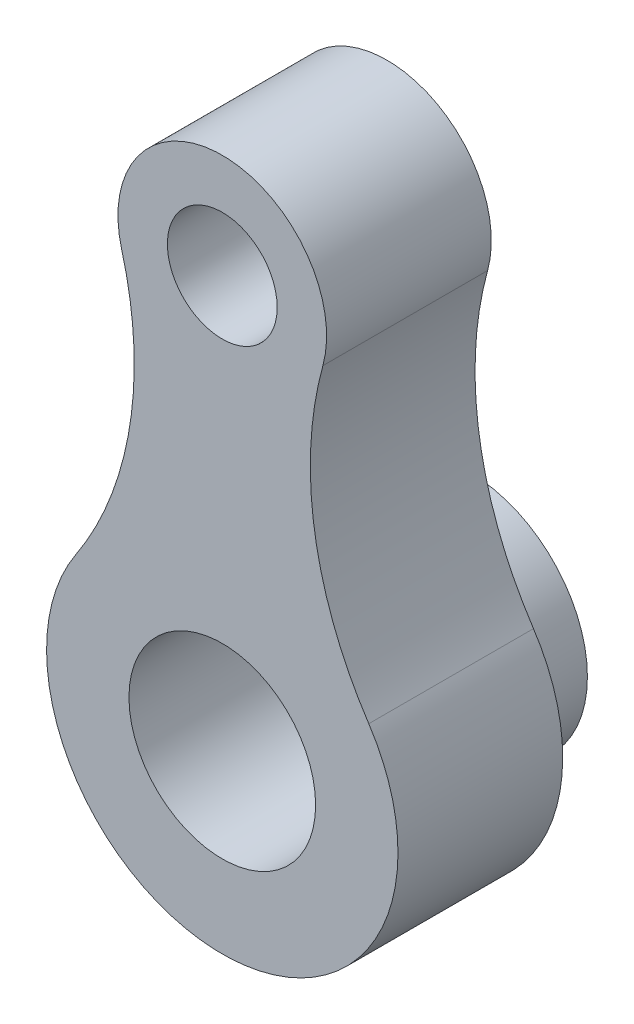
ISO-10303-21;
HEADER;
FILE_DESCRIPTION(('STEP AP214'),'2;1');
FILE_NAME('part.step','',(''),(''),'','','');
FILE_SCHEMA(('AUTOMOTIVE_DESIGN { 1 0 10303 214 1 1 1 1 }'));
ENDSEC;
DATA;
#1=APPLICATION_CONTEXT('core data for automotive mechanical design processes');
#2=APPLICATION_PROTOCOL_DEFINITION('international standard','automotive_design',2000,#1);
#3=PRODUCT_CONTEXT('',#1,'mechanical');
#4=PRODUCT('Part','Part','',(#3));
#5=PRODUCT_RELATED_PRODUCT_CATEGORY('part','',(#4));
#6=PRODUCT_DEFINITION_FORMATION('','',#4);
#7=PRODUCT_DEFINITION_CONTEXT('part definition',#1,'design');
#8=PRODUCT_DEFINITION('design','',#6,#7);
#9=PRODUCT_DEFINITION_SHAPE('','',#8);
#10=(LENGTH_UNIT() NAMED_UNIT(*) SI_UNIT(.MILLI.,.METRE.));
#11=(NAMED_UNIT(*) PLANE_ANGLE_UNIT() SI_UNIT($,.RADIAN.));
#12=(NAMED_UNIT(*) SI_UNIT($,.STERADIAN.) SOLID_ANGLE_UNIT());
#13=UNCERTAINTY_MEASURE_WITH_UNIT(LENGTH_MEASURE(1.E-05),#10,'distance_accuracy_value','');
#14=(GEOMETRIC_REPRESENTATION_CONTEXT(3) GLOBAL_UNCERTAINTY_ASSIGNED_CONTEXT((#13)) GLOBAL_UNIT_ASSIGNED_CONTEXT((#10,
#11,#12)) REPRESENTATION_CONTEXT('',''));
#15=CARTESIAN_POINT('',(0.,0.,0.));
#16=DIRECTION('',(0.,0.,1.));
#17=DIRECTION('',(1.,0.,0.));
#18=AXIS2_PLACEMENT_3D('',#15,#16,#17);
#19=CARTESIAN_POINT('',(0.,-30.0434881413248,15.));
#20=DIRECTION('',(0.,0.,-1.));
#21=DIRECTION('',(-1.,0.,0.));
#22=AXIS2_PLACEMENT_3D('',#19,#20,#21);
#23=CYLINDRICAL_SURFACE('',#22,32.);
#24=CARTESIAN_POINT('',(0.,-30.0434881413248,15.));
#25=DIRECTION('',(0.,0.,1.));
#26=DIRECTION('',(1.,0.,0.));
#27=AXIS2_PLACEMENT_3D('',#24,#25,#26);
#28=CIRCLE('',#27,32.);
#29=CARTESIAN_POINT('',(-26.6783026465097,-12.3723770302136,15.));
#30=VERTEX_POINT('',#29);
#31=CARTESIAN_POINT('',(26.6783026465097,-12.3723770302136,15.));
#32=VERTEX_POINT('',#31);
#33=EDGE_CURVE('E162',#30,#32,#28,.T.);
#34=ORIENTED_EDGE('',*,*,#33,.F.);
#35=DIRECTION('',(0.,0.,1.));
#36=VECTOR('',#35,1.);
#37=CARTESIAN_POINT('',(-26.6783026465097,-12.3723770302136,-15.));
#38=LINE('',#37,#36);
#39=CARTESIAN_POINT('',(-26.6783026465097,-12.3723770302136,-15.));
#40=VERTEX_POINT('',#39);
#41=EDGE_CURVE('E12',#40,#30,#38,.T.);
#42=ORIENTED_EDGE('',*,*,#41,.F.);
#43=CARTESIAN_POINT('',(0.,-30.0434881413248,-15.));
#44=DIRECTION('',(0.,0.,1.));
#45=DIRECTION('',(1.,0.,0.));
#46=AXIS2_PLACEMENT_3D('',#43,#44,#45);
#47=CIRCLE('',#46,32.);
#48=CARTESIAN_POINT('',(26.6783026465097,-12.3723770302136,-15.));
#49=VERTEX_POINT('',#48);
#50=EDGE_CURVE('E116',#40,#49,#47,.T.);
#51=ORIENTED_EDGE('',*,*,#50,.T.);
#52=DIRECTION('',(0.,0.,1.));
#53=VECTOR('',#52,1.);
#54=CARTESIAN_POINT('',(26.6783026465097,-12.3723770302136,-15.));
#55=LINE('',#54,#53);
#56=EDGE_CURVE('E166',#49,#32,#55,.T.);
#57=ORIENTED_EDGE('',*,*,#56,.T.);
#58=EDGE_LOOP('',(#34,#42,#51,#57));
#59=FACE_BOUND('',#58,.T.);
#60=ADVANCED_FACE('F97',(#59),#23,.T.);
#61=CARTESIAN_POINT('',(0.,0.,15.));
#62=DIRECTION('',(0.,0.,1.));
#63=DIRECTION('',(1.,0.,0.));
#64=AXIS2_PLACEMENT_3D('',#61,#62,#63);
#65=PLANE('',#64);
#66=CARTESIAN_POINT('',(0.,44.9565118586752,15.));
#67=DIRECTION('',(0.,0.,1.));
#68=DIRECTION('',(1.,0.,0.));
#69=AXIS2_PLACEMENT_3D('',#66,#67,#68);
#70=CIRCLE('',#69,10.);
#71=CARTESIAN_POINT('',(10.,44.9565118586752,15.));
#72=VERTEX_POINT('',#71);
#73=EDGE_CURVE('E176',#72,#72,#70,.F.);
#74=ORIENTED_EDGE('',*,*,#73,.T.);
#75=EDGE_LOOP('',(#74));
#76=FACE_BOUND('',#75,.T.);
#77=CARTESIAN_POINT('',(0.,-30.0434881413248,15.));
#78=DIRECTION('',(0.,0.,1.));
#79=DIRECTION('',(1.,0.,0.));
#80=AXIS2_PLACEMENT_3D('',#77,#78,#79);
#81=CIRCLE('',#80,17.);
#82=CARTESIAN_POINT('',(17.,-30.0434881413248,15.));
#83=VERTEX_POINT('',#82);
#84=EDGE_CURVE('E175',#83,#83,#81,.F.);
#85=ORIENTED_EDGE('',*,*,#84,.T.);
#86=EDGE_LOOP('',(#85));
#87=FACE_BOUND('',#86,.T.);
#88=CARTESIAN_POINT('',(-80.034907939529,22.9698451920086,15.));
#89=DIRECTION('',(0.,0.,1.));
#90=DIRECTION('',(1.,0.,0.));
#91=AXIS2_PLACEMENT_3D('',#88,#89,#90);
#92=CIRCLE('',#91,64.);
#93=CARTESIAN_POINT('',(-18.3212439861572,39.9234194891973,15.));
#94=VERTEX_POINT('',#93);
#95=EDGE_CURVE('E152',#30,#94,#92,.T.);
#96=ORIENTED_EDGE('',*,*,#95,.F.);
#97=ORIENTED_EDGE('',*,*,#33,.T.);
#98=CARTESIAN_POINT('',(80.034907939529,22.9698451920086,15.));
#99=DIRECTION('',(0.,0.,1.));
#100=DIRECTION('',(1.,0.,0.));
#101=AXIS2_PLACEMENT_3D('',#98,#99,#100);
#102=CIRCLE('',#101,64.);
#103=CARTESIAN_POINT('',(18.3212439861573,39.9234194891973,15.));
#104=VERTEX_POINT('',#103);
#105=EDGE_CURVE('E154',#32,#104,#102,.F.);
#106=ORIENTED_EDGE('',*,*,#105,.T.);
#107=CARTESIAN_POINT('',(0.,44.9565118586752,15.));
#108=DIRECTION('',(0.,0.,1.));
#109=DIRECTION('',(1.,0.,0.));
#110=AXIS2_PLACEMENT_3D('',#107,#108,#109);
#111=CIRCLE('',#110,19.);
#112=EDGE_CURVE('E138',#104,#94,#111,.T.);
#113=ORIENTED_EDGE('',*,*,#112,.T.);
#114=EDGE_LOOP('',(#96,#97,#106,#113));
#115=FACE_BOUND('',#114,.T.);
#116=ADVANCED_FACE('F150',(#76,#87,#115),#65,.T.);
#117=CARTESIAN_POINT('',(0.,44.9565118586752,15.));
#118=DIRECTION('',(0.,0.,-1.));
#119=DIRECTION('',(-1.,0.,0.));
#120=AXIS2_PLACEMENT_3D('',#117,#118,#119);
#121=CYLINDRICAL_SURFACE('',#120,19.);
#122=DIRECTION('',(0.,0.,1.));
#123=VECTOR('',#122,1.);
#124=CARTESIAN_POINT('',(-18.3212439861572,39.9234194891973,-15.));
#125=LINE('',#124,#123);
#126=CARTESIAN_POINT('',(-18.3212439861572,39.9234194891973,-15.));
#127=VERTEX_POINT('',#126);
#128=EDGE_CURVE('E106',#127,#94,#125,.T.);
#129=ORIENTED_EDGE('',*,*,#128,.T.);
#130=ORIENTED_EDGE('',*,*,#112,.F.);
#131=DIRECTION('',(0.,0.,1.));
#132=VECTOR('',#131,1.);
#133=CARTESIAN_POINT('',(18.3212439861572,39.9234194891973,-15.));
#134=LINE('',#133,#132);
#135=CARTESIAN_POINT('',(18.3212439861573,39.9234194891973,-15.));
#136=VERTEX_POINT('',#135);
#137=EDGE_CURVE('E146',#136,#104,#134,.T.);
#138=ORIENTED_EDGE('',*,*,#137,.F.);
#139=CARTESIAN_POINT('',(0.,44.9565118586752,-15.));
#140=DIRECTION('',(0.,0.,1.));
#141=DIRECTION('',(1.,0.,0.));
#142=AXIS2_PLACEMENT_3D('',#139,#140,#141);
#143=CIRCLE('',#142,19.);
#144=EDGE_CURVE('E141',#136,#127,#143,.T.);
#145=ORIENTED_EDGE('',*,*,#144,.T.);
#146=EDGE_LOOP('',(#129,#130,#138,#145));
#147=FACE_BOUND('',#146,.T.);
#148=ADVANCED_FACE('F137',(#147),#121,.T.);
#149=CARTESIAN_POINT('',(-80.034907939529,22.9698451920086,-15.));
#150=DIRECTION('',(0.,0.,1.));
#151=DIRECTION('',(1.,0.,0.));
#152=AXIS2_PLACEMENT_3D('',#149,#150,#151);
#153=CYLINDRICAL_SURFACE('',#152,64.);
#154=ORIENTED_EDGE('',*,*,#41,.T.);
#155=ORIENTED_EDGE('',*,*,#95,.T.);
#156=ORIENTED_EDGE('',*,*,#128,.F.);
#157=CARTESIAN_POINT('',(-80.034907939529,22.9698451920086,-15.));
#158=DIRECTION('',(0.,0.,1.));
#159=DIRECTION('',(1.,0.,0.));
#160=AXIS2_PLACEMENT_3D('',#157,#158,#159);
#161=CIRCLE('',#160,64.);
#162=EDGE_CURVE('E160',#40,#127,#161,.T.);
#163=ORIENTED_EDGE('',*,*,#162,.F.);
#164=EDGE_LOOP('',(#154,#155,#156,#163));
#165=FACE_BOUND('',#164,.T.);
#166=ADVANCED_FACE('F156',(#165),#153,.F.);
#167=CARTESIAN_POINT('',(80.034907939529,22.9698451920086,-15.));
#168=DIRECTION('',(0.,0.,1.));
#169=DIRECTION('',(1.,0.,0.));
#170=AXIS2_PLACEMENT_3D('',#167,#168,#169);
#171=CYLINDRICAL_SURFACE('',#170,64.);
#172=ORIENTED_EDGE('',*,*,#137,.T.);
#173=ORIENTED_EDGE('',*,*,#105,.F.);
#174=ORIENTED_EDGE('',*,*,#56,.F.);
#175=CARTESIAN_POINT('',(80.034907939529,22.9698451920086,-15.));
#176=DIRECTION('',(0.,0.,1.));
#177=DIRECTION('',(1.,0.,0.));
#178=AXIS2_PLACEMENT_3D('',#175,#176,#177);
#179=CIRCLE('',#178,64.);
#180=EDGE_CURVE('E157',#49,#136,#179,.F.);
#181=ORIENTED_EDGE('',*,*,#180,.T.);
#182=EDGE_LOOP('',(#172,#173,#174,#181));
#183=FACE_BOUND('',#182,.T.);
#184=ADVANCED_FACE('F99',(#183),#171,.F.);
#185=CARTESIAN_POINT('',(0.,0.,-15.));
#186=DIRECTION('',(0.,0.,1.));
#187=DIRECTION('',(1.,0.,0.));
#188=AXIS2_PLACEMENT_3D('',#185,#186,#187);
#189=PLANE('',#188);
#190=CARTESIAN_POINT('',(0.,44.9565118586752,-15.));
#191=DIRECTION('',(0.,0.,1.));
#192=DIRECTION('',(1.,0.,0.));
#193=AXIS2_PLACEMENT_3D('',#190,#191,#192);
#194=CIRCLE('',#193,10.);
#195=CARTESIAN_POINT('',(10.,44.9565118586752,-15.));
#196=VERTEX_POINT('',#195);
#197=EDGE_CURVE('E101',#196,#196,#194,.F.);
#198=ORIENTED_EDGE('',*,*,#197,.F.);
#199=EDGE_LOOP('',(#198));
#200=FACE_BOUND('',#199,.T.);
#201=CARTESIAN_POINT('',(0.,-30.0434881413248,-15.));
#202=DIRECTION('',(0.,0.,1.));
#203=DIRECTION('',(1.,0.,0.));
#204=AXIS2_PLACEMENT_3D('',#201,#202,#203);
#205=CIRCLE('',#204,27.5);
#206=CARTESIAN_POINT('',(27.5,-30.0434881413248,-15.));
#207=VERTEX_POINT('',#206);
#208=EDGE_CURVE('E170',#207,#207,#205,.T.);
#209=ORIENTED_EDGE('',*,*,#208,.T.);
#210=EDGE_LOOP('',(#209));
#211=FACE_BOUND('',#210,.T.);
#212=ORIENTED_EDGE('',*,*,#180,.F.);
#213=ORIENTED_EDGE('',*,*,#50,.F.);
#214=ORIENTED_EDGE('',*,*,#162,.T.);
#215=ORIENTED_EDGE('',*,*,#144,.F.);
#216=EDGE_LOOP('',(#212,#213,#214,#215));
#217=FACE_BOUND('',#216,.T.);
#218=ADVANCED_FACE('F199',(#200,#211,#217),#189,.F.);
#219=CARTESIAN_POINT('',(0.,-30.0434881413248,-49.));
#220=DIRECTION('',(0.,0.,1.));
#221=DIRECTION('',(1.,0.,0.));
#222=AXIS2_PLACEMENT_3D('',#219,#220,#221);
#223=CYLINDRICAL_SURFACE('',#222,21.5);
#224=CARTESIAN_POINT('',(0.,-30.0434881413248,-10.));
#225=DIRECTION('',(0.,0.,1.));
#226=DIRECTION('',(1.,0.,0.));
#227=AXIS2_PLACEMENT_3D('',#224,#225,#226);
#228=CIRCLE('',#227,21.5);
#229=CARTESIAN_POINT('',(21.5,-30.0434881413248,-10.));
#230=VERTEX_POINT('',#229);
#231=EDGE_CURVE('E190',#230,#230,#228,.T.);
#232=ORIENTED_EDGE('',*,*,#231,.F.);
#233=EDGE_LOOP('',(#232));
#234=FACE_BOUND('',#233,.T.);
#235=CARTESIAN_POINT('',(0.,-30.0434881413248,-30.));
#236=DIRECTION('',(0.,0.,1.));
#237=DIRECTION('',(1.,0.,0.));
#238=AXIS2_PLACEMENT_3D('',#235,#236,#237);
#239=CIRCLE('',#238,21.5);
#240=CARTESIAN_POINT('',(21.5,-30.0434881413248,-30.));
#241=VERTEX_POINT('',#240);
#242=EDGE_CURVE('E180',#241,#241,#239,.T.);
#243=ORIENTED_EDGE('',*,*,#242,.T.);
#244=EDGE_LOOP('',(#243));
#245=FACE_BOUND('',#244,.T.);
#246=ADVANCED_FACE('F201',(#234,#245),#223,.T.);
#247=CARTESIAN_POINT('',(0.,-30.0434881413248,-49.));
#248=DIRECTION('',(0.,0.,1.));
#249=DIRECTION('',(1.,0.,0.));
#250=AXIS2_PLACEMENT_3D('',#247,#248,#249);
#251=CYLINDRICAL_SURFACE('',#250,27.5);
#252=CARTESIAN_POINT('',(0.,-30.0434881413248,-10.));
#253=DIRECTION('',(0.,0.,1.));
#254=DIRECTION('',(1.,0.,0.));
#255=AXIS2_PLACEMENT_3D('',#252,#253,#254);
#256=CIRCLE('',#255,27.5);
#257=CARTESIAN_POINT('',(27.5,-30.0434881413248,-10.));
#258=VERTEX_POINT('',#257);
#259=EDGE_CURVE('E172',#258,#258,#256,.T.);
#260=ORIENTED_EDGE('',*,*,#259,.T.);
#261=EDGE_LOOP('',(#260));
#262=FACE_BOUND('',#261,.T.);
#263=ORIENTED_EDGE('',*,*,#208,.F.);
#264=EDGE_LOOP('',(#263));
#265=FACE_BOUND('',#264,.T.);
#266=ADVANCED_FACE('F208',(#262,#265),#251,.F.);
#267=CARTESIAN_POINT('',(0.,0.,-10.));
#268=DIRECTION('',(0.,0.,1.));
#269=DIRECTION('',(1.,0.,0.));
#270=AXIS2_PLACEMENT_3D('',#267,#268,#269);
#271=PLANE('',#270);
#272=ORIENTED_EDGE('',*,*,#231,.T.);
#273=EDGE_LOOP('',(#272));
#274=FACE_BOUND('',#273,.T.);
#275=ORIENTED_EDGE('',*,*,#259,.F.);
#276=EDGE_LOOP('',(#275));
#277=FACE_BOUND('',#276,.T.);
#278=ADVANCED_FACE('F224',(#274,#277),#271,.F.);
#279=CARTESIAN_POINT('',(0.,0.,-30.));
#280=DIRECTION('',(0.,0.,1.));
#281=DIRECTION('',(1.,0.,0.));
#282=AXIS2_PLACEMENT_3D('',#279,#280,#281);
#283=PLANE('',#282);
#284=CARTESIAN_POINT('',(0.,-30.0434881413248,-30.));
#285=DIRECTION('',(0.,0.,1.));
#286=DIRECTION('',(1.,0.,0.));
#287=AXIS2_PLACEMENT_3D('',#284,#285,#286);
#288=CIRCLE('',#287,17.);
#289=CARTESIAN_POINT('',(17.,-30.0434881413248,-30.));
#290=VERTEX_POINT('',#289);
#291=EDGE_CURVE('E173',#290,#290,#288,.F.);
#292=ORIENTED_EDGE('',*,*,#291,.F.);
#293=EDGE_LOOP('',(#292));
#294=FACE_BOUND('',#293,.T.);
#295=ORIENTED_EDGE('',*,*,#242,.F.);
#296=EDGE_LOOP('',(#295));
#297=FACE_BOUND('',#296,.T.);
#298=ADVANCED_FACE('F228',(#294,#297),#283,.F.);
#299=CARTESIAN_POINT('',(0.,-30.0434881413248,26.));
#300=DIRECTION('',(0.,0.,-1.));
#301=DIRECTION('',(-1.,0.,0.));
#302=AXIS2_PLACEMENT_3D('',#299,#300,#301);
#303=CYLINDRICAL_SURFACE('',#302,17.);
#304=ORIENTED_EDGE('',*,*,#84,.F.);
#305=EDGE_LOOP('',(#304));
#306=FACE_BOUND('',#305,.T.);
#307=ORIENTED_EDGE('',*,*,#291,.T.);
#308=EDGE_LOOP('',(#307));
#309=FACE_BOUND('',#308,.T.);
#310=ADVANCED_FACE('F232',(#306,#309),#303,.F.);
#311=CARTESIAN_POINT('',(0.,44.9565118586752,47.));
#312=DIRECTION('',(0.,0.,-1.));
#313=DIRECTION('',(-1.,0.,0.));
#314=AXIS2_PLACEMENT_3D('',#311,#312,#313);
#315=CYLINDRICAL_SURFACE('',#314,10.);
#316=ORIENTED_EDGE('',*,*,#73,.F.);
#317=EDGE_LOOP('',(#316));
#318=FACE_BOUND('',#317,.T.);
#319=ORIENTED_EDGE('',*,*,#197,.T.);
#320=EDGE_LOOP('',(#319));
#321=FACE_BOUND('',#320,.T.);
#322=ADVANCED_FACE('F236',(#318,#321),#315,.F.);
#323=CLOSED_SHELL('',(#60,#116,#148,#166,#184,#218,#246,#266,#278,#298,#310,#322));
#324=MANIFOLD_SOLID_BREP('B2',#323);
#325=ADVANCED_BREP_SHAPE_REPRESENTATION('',(#18,#324),#14);
#326=SHAPE_DEFINITION_REPRESENTATION(#9,#325);
ENDSEC;
END-ISO-10303-21;
